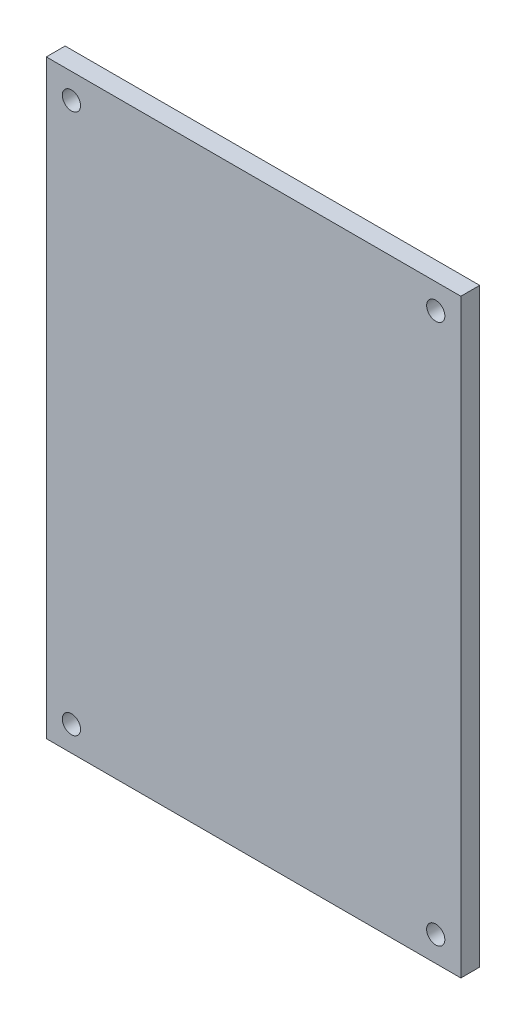
ISO-10303-21;
HEADER;
FILE_DESCRIPTION(('STEP AP214'),'2;1');
FILE_NAME('part.step','',(''),(''),'','','');
FILE_SCHEMA(('AUTOMOTIVE_DESIGN { 1 0 10303 214 1 1 1 1 }'));
ENDSEC;
DATA;
#1=APPLICATION_CONTEXT('core data for automotive mechanical design processes');
#2=APPLICATION_PROTOCOL_DEFINITION('international standard','automotive_design',2000,#1);
#3=PRODUCT_CONTEXT('',#1,'mechanical');
#4=PRODUCT('Part','Part','',(#3));
#5=PRODUCT_RELATED_PRODUCT_CATEGORY('part','',(#4));
#6=PRODUCT_DEFINITION_FORMATION('','',#4);
#7=PRODUCT_DEFINITION_CONTEXT('part definition',#1,'design');
#8=PRODUCT_DEFINITION('design','',#6,#7);
#9=PRODUCT_DEFINITION_SHAPE('','',#8);
#10=(LENGTH_UNIT() NAMED_UNIT(*) SI_UNIT(.MILLI.,.METRE.));
#11=(NAMED_UNIT(*) PLANE_ANGLE_UNIT() SI_UNIT($,.RADIAN.));
#12=(NAMED_UNIT(*) SI_UNIT($,.STERADIAN.) SOLID_ANGLE_UNIT());
#13=UNCERTAINTY_MEASURE_WITH_UNIT(LENGTH_MEASURE(1.E-05),#10,'distance_accuracy_value','');
#14=(GEOMETRIC_REPRESENTATION_CONTEXT(3) GLOBAL_UNCERTAINTY_ASSIGNED_CONTEXT((#13)) GLOBAL_UNIT_ASSIGNED_CONTEXT((#10,
#11,#12)) REPRESENTATION_CONTEXT('',''));
#15=CARTESIAN_POINT('',(0.,0.,0.));
#16=DIRECTION('',(0.,0.,1.));
#17=DIRECTION('',(1.,0.,0.));
#18=AXIS2_PLACEMENT_3D('',#15,#16,#17);
#19=CARTESIAN_POINT('',(0.,0.,3.));
#20=DIRECTION('',(0.,0.,1.));
#21=DIRECTION('',(1.,0.,0.));
#22=AXIS2_PLACEMENT_3D('',#19,#20,#21);
#23=PLANE('',#22);
#24=CARTESIAN_POINT('',(29.,44.2651764424745,3.));
#25=DIRECTION('',(0.,0.,1.));
#26=DIRECTION('',(1.,0.,0.));
#27=AXIS2_PLACEMENT_3D('',#24,#25,#26);
#28=CIRCLE('',#27,1.45);
#29=CARTESIAN_POINT('',(30.45,44.2651764424745,3.));
#30=VERTEX_POINT('',#29);
#31=EDGE_CURVE('E144',#30,#30,#28,.T.);
#32=ORIENTED_EDGE('',*,*,#31,.F.);
#33=EDGE_LOOP('',(#32));
#34=FACE_BOUND('',#33,.T.);
#35=CARTESIAN_POINT('',(-29.,44.2651764424745,3.));
#36=DIRECTION('',(0.,0.,1.));
#37=DIRECTION('',(1.,0.,0.));
#38=AXIS2_PLACEMENT_3D('',#35,#36,#37);
#39=CIRCLE('',#38,1.45);
#40=CARTESIAN_POINT('',(-27.55,44.2651764424745,3.));
#41=VERTEX_POINT('',#40);
#42=EDGE_CURVE('E114',#41,#41,#39,.T.);
#43=ORIENTED_EDGE('',*,*,#42,.F.);
#44=EDGE_LOOP('',(#43));
#45=FACE_BOUND('',#44,.T.);
#46=DIRECTION('',(0.,-1.,0.));
#47=VECTOR('',#46,1.);
#48=CARTESIAN_POINT('',(-33.,48.2651764424745,3.));
#49=LINE('',#48,#47);
#50=CARTESIAN_POINT('',(-33.,48.2651764424745,3.));
#51=VERTEX_POINT('',#50);
#52=CARTESIAN_POINT('',(-33.,-45.7348235575255,3.));
#53=VERTEX_POINT('',#52);
#54=EDGE_CURVE('E94',#51,#53,#49,.T.);
#55=ORIENTED_EDGE('',*,*,#54,.T.);
#56=DIRECTION('',(1.,0.,0.));
#57=VECTOR('',#56,1.);
#58=CARTESIAN_POINT('',(-33.,-45.7348235575255,3.));
#59=LINE('',#58,#57);
#60=CARTESIAN_POINT('',(33.,-45.7348235575255,3.));
#61=VERTEX_POINT('',#60);
#62=EDGE_CURVE('E89',#53,#61,#59,.T.);
#63=ORIENTED_EDGE('',*,*,#62,.T.);
#64=DIRECTION('',(0.,1.,0.));
#65=VECTOR('',#64,1.);
#66=CARTESIAN_POINT('',(33.,48.2651764424745,3.));
#67=LINE('',#66,#65);
#68=CARTESIAN_POINT('',(33.,48.2651764424745,3.));
#69=VERTEX_POINT('',#68);
#70=EDGE_CURVE('E92',#61,#69,#67,.T.);
#71=ORIENTED_EDGE('',*,*,#70,.T.);
#72=DIRECTION('',(-1.,0.,0.));
#73=VECTOR('',#72,1.);
#74=CARTESIAN_POINT('',(-33.,48.2651764424745,3.));
#75=LINE('',#74,#73);
#76=EDGE_CURVE('E59',#69,#51,#75,.T.);
#77=ORIENTED_EDGE('',*,*,#76,.T.);
#78=EDGE_LOOP('',(#55,#63,#71,#77));
#79=FACE_BOUND('',#78,.T.);
#80=CARTESIAN_POINT('',(29.,-41.7348235575255,3.));
#81=DIRECTION('',(0.,0.,1.));
#82=DIRECTION('',(1.,0.,0.));
#83=AXIS2_PLACEMENT_3D('',#80,#81,#82);
#84=CIRCLE('',#83,1.44999999999999);
#85=CARTESIAN_POINT('',(30.45,-41.7348235575255,3.));
#86=VERTEX_POINT('',#85);
#87=EDGE_CURVE('E136',#86,#86,#84,.T.);
#88=ORIENTED_EDGE('',*,*,#87,.F.);
#89=EDGE_LOOP('',(#88));
#90=FACE_BOUND('',#89,.T.);
#91=CARTESIAN_POINT('',(-29.,-41.7348235575255,3.));
#92=DIRECTION('',(0.,0.,1.));
#93=DIRECTION('',(1.,0.,0.));
#94=AXIS2_PLACEMENT_3D('',#91,#92,#93);
#95=CIRCLE('',#94,1.44999999999999);
#96=CARTESIAN_POINT('',(-27.55,-41.7348235575255,3.));
#97=VERTEX_POINT('',#96);
#98=EDGE_CURVE('E152',#97,#97,#95,.T.);
#99=ORIENTED_EDGE('',*,*,#98,.F.);
#100=EDGE_LOOP('',(#99));
#101=FACE_BOUND('',#100,.T.);
#102=ADVANCED_FACE('F41',(#34,#45,#79,#90,#101),#23,.T.);
#103=CARTESIAN_POINT('',(0.,0.,0.));
#104=DIRECTION('',(0.,0.,1.));
#105=DIRECTION('',(1.,0.,0.));
#106=AXIS2_PLACEMENT_3D('',#103,#104,#105);
#107=PLANE('',#106);
#108=DIRECTION('',(0.,-1.,0.));
#109=VECTOR('',#108,1.);
#110=CARTESIAN_POINT('',(-33.,48.2651764424745,0.));
#111=LINE('',#110,#109);
#112=CARTESIAN_POINT('',(-33.,48.2651764424745,0.));
#113=VERTEX_POINT('',#112);
#114=CARTESIAN_POINT('',(-33.,-45.7348235575255,0.));
#115=VERTEX_POINT('',#114);
#116=EDGE_CURVE('E110',#113,#115,#111,.T.);
#117=ORIENTED_EDGE('',*,*,#116,.F.);
#118=DIRECTION('',(-1.,0.,0.));
#119=VECTOR('',#118,1.);
#120=CARTESIAN_POINT('',(-33.,48.2651764424745,0.));
#121=LINE('',#120,#119);
#122=CARTESIAN_POINT('',(33.,48.2651764424745,0.));
#123=VERTEX_POINT('',#122);
#124=EDGE_CURVE('E82',#123,#113,#121,.T.);
#125=ORIENTED_EDGE('',*,*,#124,.F.);
#126=DIRECTION('',(0.,1.,0.));
#127=VECTOR('',#126,1.);
#128=CARTESIAN_POINT('',(33.,48.2651764424745,0.));
#129=LINE('',#128,#127);
#130=CARTESIAN_POINT('',(33.,-45.7348235575255,0.));
#131=VERTEX_POINT('',#130);
#132=EDGE_CURVE('E76',#131,#123,#129,.T.);
#133=ORIENTED_EDGE('',*,*,#132,.F.);
#134=DIRECTION('',(1.,0.,0.));
#135=VECTOR('',#134,1.);
#136=CARTESIAN_POINT('',(-33.,-45.7348235575255,0.));
#137=LINE('',#136,#135);
#138=EDGE_CURVE('E99',#115,#131,#137,.T.);
#139=ORIENTED_EDGE('',*,*,#138,.F.);
#140=EDGE_LOOP('',(#117,#125,#133,#139));
#141=FACE_BOUND('',#140,.T.);
#142=CARTESIAN_POINT('',(-29.,44.2651764424745,0.));
#143=DIRECTION('',(0.,0.,1.));
#144=DIRECTION('',(1.,0.,0.));
#145=AXIS2_PLACEMENT_3D('',#142,#143,#144);
#146=CIRCLE('',#145,1.45);
#147=CARTESIAN_POINT('',(-27.55,44.2651764424745,0.));
#148=VERTEX_POINT('',#147);
#149=EDGE_CURVE('E132',#148,#148,#146,.T.);
#150=ORIENTED_EDGE('',*,*,#149,.T.);
#151=EDGE_LOOP('',(#150));
#152=FACE_BOUND('',#151,.T.);
#153=CARTESIAN_POINT('',(29.,-41.7348235575255,0.));
#154=DIRECTION('',(0.,0.,1.));
#155=DIRECTION('',(1.,0.,0.));
#156=AXIS2_PLACEMENT_3D('',#153,#154,#155);
#157=CIRCLE('',#156,1.44999999999999);
#158=CARTESIAN_POINT('',(30.45,-41.7348235575255,0.));
#159=VERTEX_POINT('',#158);
#160=EDGE_CURVE('E140',#159,#159,#157,.T.);
#161=ORIENTED_EDGE('',*,*,#160,.T.);
#162=EDGE_LOOP('',(#161));
#163=FACE_BOUND('',#162,.T.);
#164=CARTESIAN_POINT('',(29.,44.2651764424745,0.));
#165=DIRECTION('',(0.,0.,1.));
#166=DIRECTION('',(1.,0.,0.));
#167=AXIS2_PLACEMENT_3D('',#164,#165,#166);
#168=CIRCLE('',#167,1.45);
#169=CARTESIAN_POINT('',(30.45,44.2651764424745,0.));
#170=VERTEX_POINT('',#169);
#171=EDGE_CURVE('E148',#170,#170,#168,.T.);
#172=ORIENTED_EDGE('',*,*,#171,.T.);
#173=EDGE_LOOP('',(#172));
#174=FACE_BOUND('',#173,.T.);
#175=CARTESIAN_POINT('',(-29.,-41.7348235575255,0.));
#176=DIRECTION('',(0.,0.,1.));
#177=DIRECTION('',(1.,0.,0.));
#178=AXIS2_PLACEMENT_3D('',#175,#176,#177);
#179=CIRCLE('',#178,1.44999999999999);
#180=CARTESIAN_POINT('',(-27.55,-41.7348235575255,0.));
#181=VERTEX_POINT('',#180);
#182=EDGE_CURVE('E156',#181,#181,#179,.T.);
#183=ORIENTED_EDGE('',*,*,#182,.T.);
#184=EDGE_LOOP('',(#183));
#185=FACE_BOUND('',#184,.T.);
#186=ADVANCED_FACE('F127',(#141,#152,#163,#174,#185),#107,.F.);
#187=CARTESIAN_POINT('',(-33.,48.2651764424745,3.));
#188=DIRECTION('',(1.,0.,0.));
#189=DIRECTION('',(0.,0.,-1.));
#190=AXIS2_PLACEMENT_3D('',#187,#188,#189);
#191=PLANE('',#190);
#192=ORIENTED_EDGE('',*,*,#116,.T.);
#193=DIRECTION('',(0.,0.,-1.));
#194=VECTOR('',#193,1.);
#195=CARTESIAN_POINT('',(-33.,-45.7348235575255,3.));
#196=LINE('',#195,#194);
#197=EDGE_CURVE('E11',#53,#115,#196,.T.);
#198=ORIENTED_EDGE('',*,*,#197,.F.);
#199=ORIENTED_EDGE('',*,*,#54,.F.);
#200=DIRECTION('',(0.,0.,-1.));
#201=VECTOR('',#200,1.);
#202=CARTESIAN_POINT('',(-33.,48.2651764424745,3.));
#203=LINE('',#202,#201);
#204=EDGE_CURVE('E106',#51,#113,#203,.T.);
#205=ORIENTED_EDGE('',*,*,#204,.T.);
#206=EDGE_LOOP('',(#192,#198,#199,#205));
#207=FACE_BOUND('',#206,.T.);
#208=ADVANCED_FACE('F43',(#207),#191,.F.);
#209=CARTESIAN_POINT('',(-33.,-45.7348235575255,3.));
#210=DIRECTION('',(0.,1.,0.));
#211=DIRECTION('',(0.,0.,1.));
#212=AXIS2_PLACEMENT_3D('',#209,#210,#211);
#213=PLANE('',#212);
#214=ORIENTED_EDGE('',*,*,#138,.T.);
#215=DIRECTION('',(0.,0.,-1.));
#216=VECTOR('',#215,1.);
#217=CARTESIAN_POINT('',(33.,-45.7348235575255,3.));
#218=LINE('',#217,#216);
#219=EDGE_CURVE('E51',#61,#131,#218,.T.);
#220=ORIENTED_EDGE('',*,*,#219,.F.);
#221=ORIENTED_EDGE('',*,*,#62,.F.);
#222=ORIENTED_EDGE('',*,*,#197,.T.);
#223=EDGE_LOOP('',(#214,#220,#221,#222));
#224=FACE_BOUND('',#223,.T.);
#225=ADVANCED_FACE('F98',(#224),#213,.F.);
#226=CARTESIAN_POINT('',(33.,48.2651764424745,3.));
#227=DIRECTION('',(-1.,0.,0.));
#228=DIRECTION('',(0.,0.,1.));
#229=AXIS2_PLACEMENT_3D('',#226,#227,#228);
#230=PLANE('',#229);
#231=ORIENTED_EDGE('',*,*,#132,.T.);
#232=DIRECTION('',(0.,0.,-1.));
#233=VECTOR('',#232,1.);
#234=CARTESIAN_POINT('',(33.,48.2651764424745,3.));
#235=LINE('',#234,#233);
#236=EDGE_CURVE('E101',#69,#123,#235,.T.);
#237=ORIENTED_EDGE('',*,*,#236,.F.);
#238=ORIENTED_EDGE('',*,*,#70,.F.);
#239=ORIENTED_EDGE('',*,*,#219,.T.);
#240=EDGE_LOOP('',(#231,#237,#238,#239));
#241=FACE_BOUND('',#240,.T.);
#242=ADVANCED_FACE('F102',(#241),#230,.F.);
#243=CARTESIAN_POINT('',(-33.,48.2651764424745,3.));
#244=DIRECTION('',(0.,-1.,0.));
#245=DIRECTION('',(0.,0.,-1.));
#246=AXIS2_PLACEMENT_3D('',#243,#244,#245);
#247=PLANE('',#246);
#248=ORIENTED_EDGE('',*,*,#124,.T.);
#249=ORIENTED_EDGE('',*,*,#204,.F.);
#250=ORIENTED_EDGE('',*,*,#76,.F.);
#251=ORIENTED_EDGE('',*,*,#236,.T.);
#252=EDGE_LOOP('',(#248,#249,#250,#251));
#253=FACE_BOUND('',#252,.T.);
#254=ADVANCED_FACE('F124',(#253),#247,.F.);
#255=CARTESIAN_POINT('',(-29.,44.2651764424745,3.));
#256=DIRECTION('',(0.,0.,-1.));
#257=DIRECTION('',(-1.,0.,0.));
#258=AXIS2_PLACEMENT_3D('',#255,#256,#257);
#259=CYLINDRICAL_SURFACE('',#258,1.45);
#260=ORIENTED_EDGE('',*,*,#42,.T.);
#261=EDGE_LOOP('',(#260));
#262=FACE_BOUND('',#261,.T.);
#263=ORIENTED_EDGE('',*,*,#149,.F.);
#264=EDGE_LOOP('',(#263));
#265=FACE_BOUND('',#264,.T.);
#266=ADVANCED_FACE('F177',(#262,#265),#259,.F.);
#267=CARTESIAN_POINT('',(29.,-41.7348235575255,3.));
#268=DIRECTION('',(0.,0.,-1.));
#269=DIRECTION('',(-1.,0.,0.));
#270=AXIS2_PLACEMENT_3D('',#267,#268,#269);
#271=CYLINDRICAL_SURFACE('',#270,1.44999999999999);
#272=ORIENTED_EDGE('',*,*,#87,.T.);
#273=EDGE_LOOP('',(#272));
#274=FACE_BOUND('',#273,.T.);
#275=ORIENTED_EDGE('',*,*,#160,.F.);
#276=EDGE_LOOP('',(#275));
#277=FACE_BOUND('',#276,.T.);
#278=ADVANCED_FACE('F223',(#274,#277),#271,.F.);
#279=CARTESIAN_POINT('',(29.,44.2651764424745,3.));
#280=DIRECTION('',(0.,0.,-1.));
#281=DIRECTION('',(-1.,0.,0.));
#282=AXIS2_PLACEMENT_3D('',#279,#280,#281);
#283=CYLINDRICAL_SURFACE('',#282,1.45);
#284=ORIENTED_EDGE('',*,*,#31,.T.);
#285=EDGE_LOOP('',(#284));
#286=FACE_BOUND('',#285,.T.);
#287=ORIENTED_EDGE('',*,*,#171,.F.);
#288=EDGE_LOOP('',(#287));
#289=FACE_BOUND('',#288,.T.);
#290=ADVANCED_FACE('F231',(#286,#289),#283,.F.);
#291=CARTESIAN_POINT('',(-29.,-41.7348235575255,3.));
#292=DIRECTION('',(0.,0.,-1.));
#293=DIRECTION('',(-1.,0.,0.));
#294=AXIS2_PLACEMENT_3D('',#291,#292,#293);
#295=CYLINDRICAL_SURFACE('',#294,1.44999999999999);
#296=ORIENTED_EDGE('',*,*,#98,.T.);
#297=EDGE_LOOP('',(#296));
#298=FACE_BOUND('',#297,.T.);
#299=ORIENTED_EDGE('',*,*,#182,.F.);
#300=EDGE_LOOP('',(#299));
#301=FACE_BOUND('',#300,.T.);
#302=ADVANCED_FACE('F164',(#298,#301),#295,.F.);
#303=CLOSED_SHELL('',(#102,#186,#208,#225,#242,#254,#266,#278,#290,#302));
#304=MANIFOLD_SOLID_BREP('B2',#303);
#305=ADVANCED_BREP_SHAPE_REPRESENTATION('',(#18,#304),#14);
#306=SHAPE_DEFINITION_REPRESENTATION(#9,#305);
ENDSEC;
END-ISO-10303-21;
